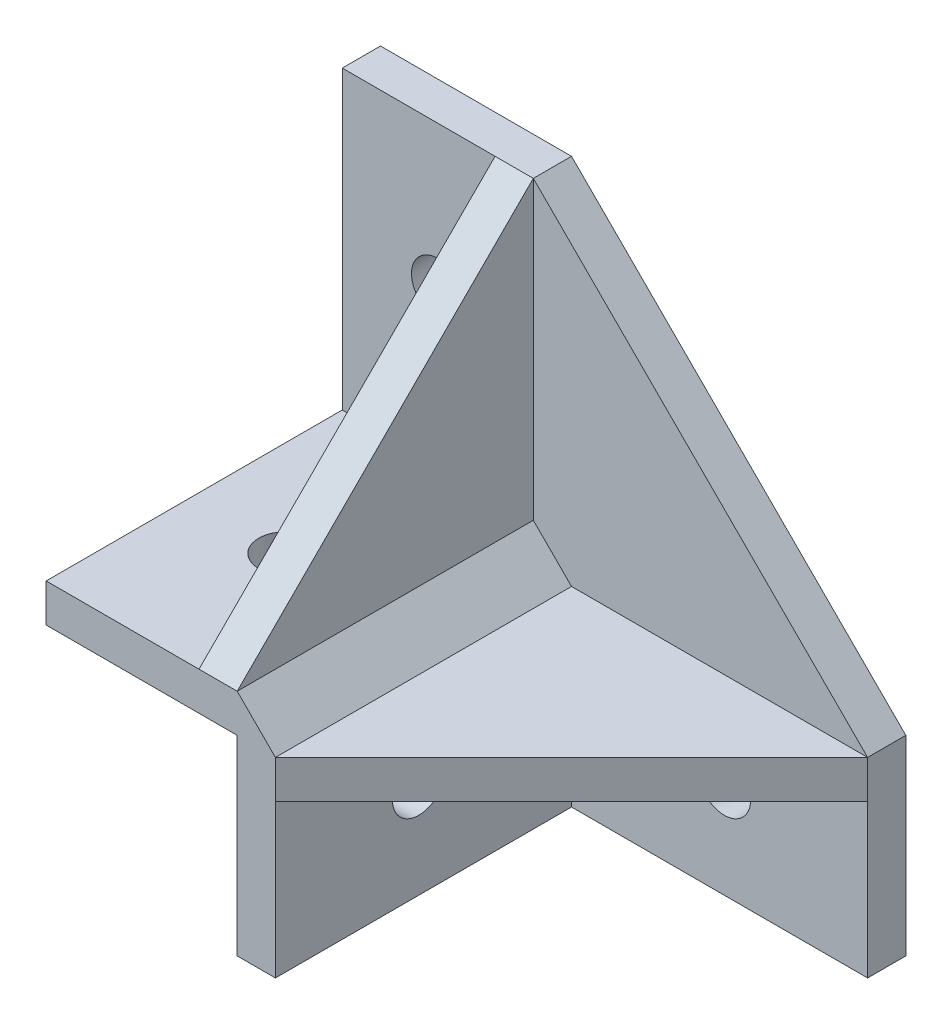
ISO-10303-21;
HEADER;
FILE_DESCRIPTION(('STEP AP214'),'2;1');
FILE_NAME('part.step','',(''),(''),'','','');
FILE_SCHEMA(('AUTOMOTIVE_DESIGN { 1 0 10303 214 1 1 1 1 }'));
ENDSEC;
DATA;
#1=APPLICATION_CONTEXT('core data for automotive mechanical design processes');
#2=APPLICATION_PROTOCOL_DEFINITION('international standard','automotive_design',2000,#1);
#3=PRODUCT_CONTEXT('',#1,'mechanical');
#4=PRODUCT('Part','Part','',(#3));
#5=PRODUCT_RELATED_PRODUCT_CATEGORY('part','',(#4));
#6=PRODUCT_DEFINITION_FORMATION('','',#4);
#7=PRODUCT_DEFINITION_CONTEXT('part definition',#1,'design');
#8=PRODUCT_DEFINITION('design','',#6,#7);
#9=PRODUCT_DEFINITION_SHAPE('','',#8);
#10=(LENGTH_UNIT() NAMED_UNIT(*) SI_UNIT(.MILLI.,.METRE.));
#11=(NAMED_UNIT(*) PLANE_ANGLE_UNIT() SI_UNIT($,.RADIAN.));
#12=(NAMED_UNIT(*) SI_UNIT($,.STERADIAN.) SOLID_ANGLE_UNIT());
#13=UNCERTAINTY_MEASURE_WITH_UNIT(LENGTH_MEASURE(1.E-05),#10,'distance_accuracy_value','');
#14=(GEOMETRIC_REPRESENTATION_CONTEXT(3) GLOBAL_UNCERTAINTY_ASSIGNED_CONTEXT((#13)) GLOBAL_UNIT_ASSIGNED_CONTEXT((#10,
#11,#12)) REPRESENTATION_CONTEXT('',''));
#15=CARTESIAN_POINT('',(0.,0.,0.));
#16=DIRECTION('',(0.,0.,1.));
#17=DIRECTION('',(1.,0.,0.));
#18=AXIS2_PLACEMENT_3D('',#15,#16,#17);
#19=CARTESIAN_POINT('',(0.,0.,4.));
#20=DIRECTION('',(0.,0.,1.));
#21=DIRECTION('',(1.,0.,0.));
#22=AXIS2_PLACEMENT_3D('',#19,#20,#21);
#23=PLANE('',#22);
#24=CARTESIAN_POINT('',(-10.,20.,4.));
#25=DIRECTION('',(0.,0.,1.));
#26=DIRECTION('',(1.,0.,0.));
#27=AXIS2_PLACEMENT_3D('',#24,#25,#26);
#28=CIRCLE('',#27,2.75);
#29=CARTESIAN_POINT('',(-7.25,20.,4.));
#30=VERTEX_POINT('',#29);
#31=EDGE_CURVE('E174',#30,#30,#28,.F.);
#32=ORIENTED_EDGE('',*,*,#31,.T.);
#33=EDGE_LOOP('',(#32));
#34=FACE_BOUND('',#33,.T.);
#35=DIRECTION('',(-1.,0.,0.));
#36=VECTOR('',#35,1.);
#37=CARTESIAN_POINT('',(-20.,4.,4.));
#38=LINE('',#37,#36);
#39=CARTESIAN_POINT('',(-4.,4.,4.));
#40=VERTEX_POINT('',#39);
#41=CARTESIAN_POINT('',(-20.,4.,4.));
#42=VERTEX_POINT('',#41);
#43=EDGE_CURVE('E54',#40,#42,#38,.T.);
#44=ORIENTED_EDGE('',*,*,#43,.F.);
#45=DIRECTION('',(0.,-1.,0.));
#46=VECTOR('',#45,1.);
#47=CARTESIAN_POINT('',(-4.,35.,4.));
#48=LINE('',#47,#46);
#49=CARTESIAN_POINT('',(-4.,35.,4.));
#50=VERTEX_POINT('',#49);
#51=EDGE_CURVE('E171',#50,#40,#48,.T.);
#52=ORIENTED_EDGE('',*,*,#51,.F.);
#53=DIRECTION('',(-1.,0.,0.));
#54=VECTOR('',#53,1.);
#55=CARTESIAN_POINT('',(-20.,35.,4.));
#56=LINE('',#55,#54);
#57=CARTESIAN_POINT('',(-20.,35.,4.));
#58=VERTEX_POINT('',#57);
#59=EDGE_CURVE('E227',#50,#58,#56,.T.);
#60=ORIENTED_EDGE('',*,*,#59,.T.);
#61=DIRECTION('',(0.,-1.,0.));
#62=VECTOR('',#61,1.);
#63=CARTESIAN_POINT('',(-20.,35.,4.));
#64=LINE('',#63,#62);
#65=EDGE_CURVE('E217',#58,#42,#64,.T.);
#66=ORIENTED_EDGE('',*,*,#65,.T.);
#67=EDGE_LOOP('',(#44,#52,#60,#66));
#68=FACE_BOUND('',#67,.T.);
#69=ADVANCED_FACE('F39',(#34,#68),#23,.T.);
#70=DIRECTION('',(0.,1.,0.));
#71=VECTOR('',#70,1.);
#72=CARTESIAN_POINT('',(0.,4.,4.));
#73=LINE('',#72,#71);
#74=CARTESIAN_POINT('',(0.,4.,4.));
#75=VERTEX_POINT('',#74);
#76=CARTESIAN_POINT('',(0.,35.,4.));
#77=VERTEX_POINT('',#76);
#78=EDGE_CURVE('E62',#75,#77,#73,.T.);
#79=ORIENTED_EDGE('',*,*,#78,.F.);
#80=DIRECTION('',(-0.707106781186548,0.707106781186548,0.));
#81=VECTOR('',#80,1.);
#82=CARTESIAN_POINT('',(4.,0.,4.));
#83=LINE('',#82,#81);
#84=CARTESIAN_POINT('',(4.,0.,4.));
#85=VERTEX_POINT('',#84);
#86=EDGE_CURVE('E197',#85,#75,#83,.T.);
#87=ORIENTED_EDGE('',*,*,#86,.F.);
#88=DIRECTION('',(-1.,0.,0.));
#89=VECTOR('',#88,1.);
#90=CARTESIAN_POINT('',(35.,0.,4.));
#91=LINE('',#90,#89);
#92=CARTESIAN_POINT('',(35.,0.,4.));
#93=VERTEX_POINT('',#92);
#94=EDGE_CURVE('E194',#93,#85,#91,.T.);
#95=ORIENTED_EDGE('',*,*,#94,.F.);
#96=DIRECTION('',(-0.707106781186548,0.707106781186548,0.));
#97=VECTOR('',#96,1.);
#98=CARTESIAN_POINT('',(0.,35.,4.));
#99=LINE('',#98,#97);
#100=EDGE_CURVE('E225',#93,#77,#99,.T.);
#101=ORIENTED_EDGE('',*,*,#100,.T.);
#102=EDGE_LOOP('',(#79,#87,#95,#101));
#103=FACE_BOUND('',#102,.T.);
#104=ADVANCED_FACE('F337',(#103),#23,.T.);
#105=CARTESIAN_POINT('',(-20.,35.,4.));
#106=DIRECTION('',(1.,0.,0.));
#107=DIRECTION('',(0.,1.,0.));
#108=AXIS2_PLACEMENT_3D('',#105,#106,#107);
#109=PLANE('',#108);
#110=DIRECTION('',(0.,-1.,0.));
#111=VECTOR('',#110,1.);
#112=CARTESIAN_POINT('',(-20.,35.,0.));
#113=LINE('',#112,#111);
#114=CARTESIAN_POINT('',(-20.,35.,0.));
#115=VERTEX_POINT('',#114);
#116=CARTESIAN_POINT('',(-20.,0.,0.));
#117=VERTEX_POINT('',#116);
#118=EDGE_CURVE('E150',#115,#117,#113,.T.);
#119=ORIENTED_EDGE('',*,*,#118,.T.);
#120=DIRECTION('',(0.,0.,-1.));
#121=VECTOR('',#120,1.);
#122=CARTESIAN_POINT('',(-20.,0.,4.));
#123=LINE('',#122,#121);
#124=CARTESIAN_POINT('',(-20.,0.,35.));
#125=VERTEX_POINT('',#124);
#126=EDGE_CURVE('E142',#125,#117,#123,.T.);
#127=ORIENTED_EDGE('',*,*,#126,.F.);
#128=DIRECTION('',(0.,-1.,0.));
#129=VECTOR('',#128,1.);
#130=CARTESIAN_POINT('',(-20.,0.,35.));
#131=LINE('',#130,#129);
#132=CARTESIAN_POINT('',(-20.,4.,35.));
#133=VERTEX_POINT('',#132);
#134=EDGE_CURVE('E147',#133,#125,#131,.T.);
#135=ORIENTED_EDGE('',*,*,#134,.F.);
#136=DIRECTION('',(0.,0.,-1.));
#137=VECTOR('',#136,1.);
#138=CARTESIAN_POINT('',(-20.,4.,35.));
#139=LINE('',#138,#137);
#140=EDGE_CURVE('E186',#133,#42,#139,.T.);
#141=ORIENTED_EDGE('',*,*,#140,.T.);
#142=ORIENTED_EDGE('',*,*,#65,.F.);
#143=DIRECTION('',(0.,0.,-1.));
#144=VECTOR('',#143,1.);
#145=CARTESIAN_POINT('',(-20.,35.,4.));
#146=LINE('',#145,#144);
#147=EDGE_CURVE('E229',#58,#115,#146,.T.);
#148=ORIENTED_EDGE('',*,*,#147,.T.);
#149=EDGE_LOOP('',(#119,#127,#135,#141,#142,#148));
#150=FACE_BOUND('',#149,.T.);
#151=ADVANCED_FACE('F144',(#150),#109,.F.);
#152=CARTESIAN_POINT('',(-20.,0.,4.));
#153=DIRECTION('',(0.,1.,0.));
#154=DIRECTION('',(0.,0.,1.));
#155=AXIS2_PLACEMENT_3D('',#152,#153,#154);
#156=PLANE('',#155);
#157=CARTESIAN_POINT('',(-10.,0.,20.));
#158=DIRECTION('',(0.,-1.,0.));
#159=DIRECTION('',(0.,0.,-1.));
#160=AXIS2_PLACEMENT_3D('',#157,#158,#159);
#161=CIRCLE('',#160,2.75);
#162=CARTESIAN_POINT('',(-10.,0.,17.25));
#163=VERTEX_POINT('',#162);
#164=EDGE_CURVE('E360',#163,#163,#161,.T.);
#165=ORIENTED_EDGE('',*,*,#164,.F.);
#166=EDGE_LOOP('',(#165));
#167=FACE_BOUND('',#166,.T.);
#168=DIRECTION('',(1.,0.,0.));
#169=VECTOR('',#168,1.);
#170=CARTESIAN_POINT('',(-20.,0.,0.));
#171=LINE('',#170,#169);
#172=CARTESIAN_POINT('',(0.,0.,0.));
#173=VERTEX_POINT('',#172);
#174=EDGE_CURVE('E231',#117,#173,#171,.T.);
#175=ORIENTED_EDGE('',*,*,#174,.T.);
#176=DIRECTION('',(0.,0.,-1.));
#177=VECTOR('',#176,1.);
#178=CARTESIAN_POINT('',(0.,0.,4.));
#179=LINE('',#178,#177);
#180=CARTESIAN_POINT('',(0.,0.,35.));
#181=VERTEX_POINT('',#180);
#182=EDGE_CURVE('E153',#181,#173,#179,.T.);
#183=ORIENTED_EDGE('',*,*,#182,.F.);
#184=DIRECTION('',(1.,0.,0.));
#185=VECTOR('',#184,1.);
#186=CARTESIAN_POINT('',(-20.,0.,35.));
#187=LINE('',#186,#185);
#188=EDGE_CURVE('E156',#125,#181,#187,.T.);
#189=ORIENTED_EDGE('',*,*,#188,.F.);
#190=ORIENTED_EDGE('',*,*,#126,.T.);
#191=EDGE_LOOP('',(#175,#183,#189,#190));
#192=FACE_BOUND('',#191,.T.);
#193=ADVANCED_FACE('F157',(#167,#192),#156,.F.);
#194=CARTESIAN_POINT('',(0.,0.,4.));
#195=DIRECTION('',(1.,0.,0.));
#196=DIRECTION('',(0.,0.,-1.));
#197=AXIS2_PLACEMENT_3D('',#194,#195,#196);
#198=PLANE('',#197);
#199=CARTESIAN_POINT('',(0.,-10.,20.));
#200=DIRECTION('',(-1.,0.,0.));
#201=DIRECTION('',(0.,0.,1.));
#202=AXIS2_PLACEMENT_3D('',#199,#200,#201);
#203=CIRCLE('',#202,2.75);
#204=CARTESIAN_POINT('',(0.,-10.,22.75));
#205=VERTEX_POINT('',#204);
#206=EDGE_CURVE('E549',#205,#205,#203,.T.);
#207=ORIENTED_EDGE('',*,*,#206,.F.);
#208=EDGE_LOOP('',(#207));
#209=FACE_BOUND('',#208,.T.);
#210=DIRECTION('',(0.,-1.,0.));
#211=VECTOR('',#210,1.);
#212=CARTESIAN_POINT('',(0.,0.,0.));
#213=LINE('',#212,#211);
#214=CARTESIAN_POINT('',(0.,-20.,0.));
#215=VERTEX_POINT('',#214);
#216=EDGE_CURVE('E233',#173,#215,#213,.T.);
#217=ORIENTED_EDGE('',*,*,#216,.T.);
#218=DIRECTION('',(0.,0.,-1.));
#219=VECTOR('',#218,1.);
#220=CARTESIAN_POINT('',(0.,-20.,4.));
#221=LINE('',#220,#219);
#222=CARTESIAN_POINT('',(0.,-20.,35.));
#223=VERTEX_POINT('',#222);
#224=EDGE_CURVE('E252',#223,#215,#221,.T.);
#225=ORIENTED_EDGE('',*,*,#224,.F.);
#226=DIRECTION('',(0.,-1.,0.));
#227=VECTOR('',#226,1.);
#228=CARTESIAN_POINT('',(0.,0.,35.));
#229=LINE('',#228,#227);
#230=EDGE_CURVE('E162',#181,#223,#229,.T.);
#231=ORIENTED_EDGE('',*,*,#230,.F.);
#232=ORIENTED_EDGE('',*,*,#182,.T.);
#233=EDGE_LOOP('',(#217,#225,#231,#232));
#234=FACE_BOUND('',#233,.T.);
#235=ADVANCED_FACE('F317',(#209,#234),#198,.F.);
#236=CARTESIAN_POINT('',(0.,-20.,4.));
#237=DIRECTION('',(0.,1.,0.));
#238=DIRECTION('',(-1.,0.,0.));
#239=AXIS2_PLACEMENT_3D('',#236,#237,#238);
#240=PLANE('',#239);
#241=DIRECTION('',(1.,0.,0.));
#242=VECTOR('',#241,1.);
#243=CARTESIAN_POINT('',(0.,-20.,0.));
#244=LINE('',#243,#242);
#245=CARTESIAN_POINT('',(35.,-20.,0.));
#246=VERTEX_POINT('',#245);
#247=EDGE_CURVE('E235',#215,#246,#244,.T.);
#248=ORIENTED_EDGE('',*,*,#247,.T.);
#249=DIRECTION('',(0.,0.,-1.));
#250=VECTOR('',#249,1.);
#251=CARTESIAN_POINT('',(35.,-20.,4.));
#252=LINE('',#251,#250);
#253=CARTESIAN_POINT('',(35.,-20.,4.));
#254=VERTEX_POINT('',#253);
#255=EDGE_CURVE('E249',#254,#246,#252,.T.);
#256=ORIENTED_EDGE('',*,*,#255,.F.);
#257=DIRECTION('',(1.,0.,0.));
#258=VECTOR('',#257,1.);
#259=CARTESIAN_POINT('',(0.,-20.,4.));
#260=LINE('',#259,#258);
#261=CARTESIAN_POINT('',(4.,-20.,4.));
#262=VERTEX_POINT('',#261);
#263=EDGE_CURVE('E219',#262,#254,#260,.T.);
#264=ORIENTED_EDGE('',*,*,#263,.F.);
#265=DIRECTION('',(0.,0.,-1.));
#266=VECTOR('',#265,1.);
#267=CARTESIAN_POINT('',(4.,-20.,35.));
#268=LINE('',#267,#266);
#269=CARTESIAN_POINT('',(4.,-20.,35.));
#270=VERTEX_POINT('',#269);
#271=EDGE_CURVE('E214',#270,#262,#268,.T.);
#272=ORIENTED_EDGE('',*,*,#271,.F.);
#273=DIRECTION('',(1.,0.,0.));
#274=VECTOR('',#273,1.);
#275=CARTESIAN_POINT('',(0.,-20.,35.));
#276=LINE('',#275,#274);
#277=EDGE_CURVE('E178',#223,#270,#276,.T.);
#278=ORIENTED_EDGE('',*,*,#277,.F.);
#279=ORIENTED_EDGE('',*,*,#224,.T.);
#280=EDGE_LOOP('',(#248,#256,#264,#272,#278,#279));
#281=FACE_BOUND('',#280,.T.);
#282=ADVANCED_FACE('F321',(#281),#240,.F.);
#283=CARTESIAN_POINT('',(35.,0.,4.));
#284=DIRECTION('',(-1.,0.,0.));
#285=DIRECTION('',(0.,0.,1.));
#286=AXIS2_PLACEMENT_3D('',#283,#284,#285);
#287=PLANE('',#286);
#288=DIRECTION('',(0.,0.,-1.));
#289=VECTOR('',#288,1.);
#290=CARTESIAN_POINT('',(35.,0.,4.));
#291=LINE('',#290,#289);
#292=CARTESIAN_POINT('',(35.,0.,0.));
#293=VERTEX_POINT('',#292);
#294=EDGE_CURVE('E246',#93,#293,#291,.T.);
#295=ORIENTED_EDGE('',*,*,#294,.F.);
#296=DIRECTION('',(0.,-1.,0.));
#297=VECTOR('',#296,1.);
#298=CARTESIAN_POINT('',(35.,0.,3.99999999999987));
#299=LINE('',#298,#297);
#300=CARTESIAN_POINT('',(35.,-4.,4.));
#301=VERTEX_POINT('',#300);
#302=EDGE_CURVE('E47',#93,#301,#299,.T.);
#303=ORIENTED_EDGE('',*,*,#302,.T.);
#304=DIRECTION('',(0.,1.,0.));
#305=VECTOR('',#304,1.);
#306=CARTESIAN_POINT('',(35.,0.,4.));
#307=LINE('',#306,#305);
#308=EDGE_CURVE('E222',#254,#301,#307,.T.);
#309=ORIENTED_EDGE('',*,*,#308,.F.);
#310=ORIENTED_EDGE('',*,*,#255,.T.);
#311=DIRECTION('',(0.,1.,0.));
#312=VECTOR('',#311,1.);
#313=CARTESIAN_POINT('',(35.,0.,0.));
#314=LINE('',#313,#312);
#315=EDGE_CURVE('E237',#246,#293,#314,.T.);
#316=ORIENTED_EDGE('',*,*,#315,.T.);
#317=EDGE_LOOP('',(#295,#303,#309,#310,#316));
#318=FACE_BOUND('',#317,.T.);
#319=ADVANCED_FACE('F271',(#318),#287,.F.);
#320=CARTESIAN_POINT('',(0.,35.,4.));
#321=DIRECTION('',(-0.707106781186547,-0.707106781186547,0.));
#322=DIRECTION('',(0.707106781186548,-0.707106781186548,0.));
#323=AXIS2_PLACEMENT_3D('',#320,#321,#322);
#324=PLANE('',#323);
#325=DIRECTION('',(-0.707106781186548,0.707106781186548,0.));
#326=VECTOR('',#325,1.);
#327=CARTESIAN_POINT('',(0.,35.,0.));
#328=LINE('',#327,#326);
#329=CARTESIAN_POINT('',(0.,35.,0.));
#330=VERTEX_POINT('',#329);
#331=EDGE_CURVE('E239',#293,#330,#328,.T.);
#332=ORIENTED_EDGE('',*,*,#331,.T.);
#333=DIRECTION('',(0.,0.,-1.));
#334=VECTOR('',#333,1.);
#335=CARTESIAN_POINT('',(0.,35.,4.));
#336=LINE('',#335,#334);
#337=EDGE_CURVE('E243',#77,#330,#336,.T.);
#338=ORIENTED_EDGE('',*,*,#337,.F.);
#339=ORIENTED_EDGE('',*,*,#100,.F.);
#340=ORIENTED_EDGE('',*,*,#294,.T.);
#341=EDGE_LOOP('',(#332,#338,#339,#340));
#342=FACE_BOUND('',#341,.T.);
#343=ADVANCED_FACE('F348',(#342),#324,.F.);
#344=CARTESIAN_POINT('',(-20.,35.,4.));
#345=DIRECTION('',(0.,-1.,0.));
#346=DIRECTION('',(0.,0.,-1.));
#347=AXIS2_PLACEMENT_3D('',#344,#345,#346);
#348=PLANE('',#347);
#349=ORIENTED_EDGE('',*,*,#59,.F.);
#350=DIRECTION('',(1.,0.,0.));
#351=VECTOR('',#350,1.);
#352=CARTESIAN_POINT('',(-20.,35.,3.99999999999987));
#353=LINE('',#352,#351);
#354=EDGE_CURVE('E262',#50,#77,#353,.T.);
#355=ORIENTED_EDGE('',*,*,#354,.T.);
#356=ORIENTED_EDGE('',*,*,#337,.T.);
#357=DIRECTION('',(-1.,0.,0.));
#358=VECTOR('',#357,1.);
#359=CARTESIAN_POINT('',(-20.,35.,0.));
#360=LINE('',#359,#358);
#361=EDGE_CURVE('E220',#330,#115,#360,.T.);
#362=ORIENTED_EDGE('',*,*,#361,.T.);
#363=ORIENTED_EDGE('',*,*,#147,.F.);
#364=EDGE_LOOP('',(#349,#355,#356,#362,#363));
#365=FACE_BOUND('',#364,.T.);
#366=ADVANCED_FACE('F307',(#365),#348,.F.);
#367=CARTESIAN_POINT('',(20.,-10.,4.));
#368=DIRECTION('',(0.,0.,1.));
#369=DIRECTION('',(1.,0.,0.));
#370=AXIS2_PLACEMENT_3D('',#367,#368,#369);
#371=CIRCLE('',#370,2.75);
#372=CARTESIAN_POINT('',(22.75,-10.,4.));
#373=VERTEX_POINT('',#372);
#374=EDGE_CURVE('E352',#373,#373,#371,.F.);
#375=ORIENTED_EDGE('',*,*,#374,.T.);
#376=EDGE_LOOP('',(#375));
#377=FACE_BOUND('',#376,.T.);
#378=DIRECTION('',(1.,0.,0.));
#379=VECTOR('',#378,1.);
#380=CARTESIAN_POINT('',(4.,-4.,4.));
#381=LINE('',#380,#379);
#382=CARTESIAN_POINT('',(4.,-4.,4.));
#383=VERTEX_POINT('',#382);
#384=EDGE_CURVE('E190',#383,#301,#381,.T.);
#385=ORIENTED_EDGE('',*,*,#384,.F.);
#386=DIRECTION('',(0.,1.,0.));
#387=VECTOR('',#386,1.);
#388=CARTESIAN_POINT('',(4.,-20.,4.));
#389=LINE('',#388,#387);
#390=EDGE_CURVE('E187',#262,#383,#389,.T.);
#391=ORIENTED_EDGE('',*,*,#390,.F.);
#392=ORIENTED_EDGE('',*,*,#263,.T.);
#393=ORIENTED_EDGE('',*,*,#308,.T.);
#394=EDGE_LOOP('',(#385,#391,#392,#393));
#395=FACE_BOUND('',#394,.T.);
#396=ADVANCED_FACE('F276',(#377,#395),#23,.T.);
#397=CARTESIAN_POINT('',(0.,0.,0.));
#398=DIRECTION('',(0.,0.,1.));
#399=DIRECTION('',(1.,0.,0.));
#400=AXIS2_PLACEMENT_3D('',#397,#398,#399);
#401=PLANE('',#400);
#402=CARTESIAN_POINT('',(20.,-10.,0.));
#403=DIRECTION('',(0.,0.,-1.));
#404=DIRECTION('',(-1.,0.,0.));
#405=AXIS2_PLACEMENT_3D('',#402,#403,#404);
#406=CIRCLE('',#405,2.75);
#407=CARTESIAN_POINT('',(17.25,-10.,0.));
#408=VERTEX_POINT('',#407);
#409=EDGE_CURVE('E354',#408,#408,#406,.T.);
#410=ORIENTED_EDGE('',*,*,#409,.F.);
#411=EDGE_LOOP('',(#410));
#412=FACE_BOUND('',#411,.T.);
#413=CARTESIAN_POINT('',(-10.,20.,0.));
#414=DIRECTION('',(0.,0.,-1.));
#415=DIRECTION('',(-1.,0.,0.));
#416=AXIS2_PLACEMENT_3D('',#413,#414,#415);
#417=CIRCLE('',#416,2.75);
#418=CARTESIAN_POINT('',(-12.75,20.,0.));
#419=VERTEX_POINT('',#418);
#420=EDGE_CURVE('E191',#419,#419,#417,.T.);
#421=ORIENTED_EDGE('',*,*,#420,.F.);
#422=EDGE_LOOP('',(#421));
#423=FACE_BOUND('',#422,.T.);
#424=ORIENTED_EDGE('',*,*,#118,.F.);
#425=ORIENTED_EDGE('',*,*,#361,.F.);
#426=ORIENTED_EDGE('',*,*,#331,.F.);
#427=ORIENTED_EDGE('',*,*,#315,.F.);
#428=ORIENTED_EDGE('',*,*,#247,.F.);
#429=ORIENTED_EDGE('',*,*,#216,.F.);
#430=ORIENTED_EDGE('',*,*,#174,.F.);
#431=EDGE_LOOP('',(#424,#425,#426,#427,#428,#429,#430));
#432=FACE_BOUND('',#431,.T.);
#433=ADVANCED_FACE('F312',(#412,#423,#432),#401,.F.);
#434=CARTESIAN_POINT('',(4.,-20.,35.));
#435=DIRECTION('',(-1.,0.,0.));
#436=DIRECTION('',(0.,0.,1.));
#437=AXIS2_PLACEMENT_3D('',#434,#435,#436);
#438=PLANE('',#437);
#439=CARTESIAN_POINT('',(4.,-10.,20.));
#440=DIRECTION('',(-1.,0.,0.));
#441=DIRECTION('',(0.,0.,1.));
#442=AXIS2_PLACEMENT_3D('',#439,#440,#441);
#443=CIRCLE('',#442,2.75);
#444=CARTESIAN_POINT('',(4.,-10.,22.75));
#445=VERTEX_POINT('',#444);
#446=EDGE_CURVE('E546',#445,#445,#443,.F.);
#447=ORIENTED_EDGE('',*,*,#446,.F.);
#448=EDGE_LOOP('',(#447));
#449=FACE_BOUND('',#448,.T.);
#450=ORIENTED_EDGE('',*,*,#390,.T.);
#451=DIRECTION('',(0.,0.,-1.));
#452=VECTOR('',#451,1.);
#453=CARTESIAN_POINT('',(4.,-4.,35.));
#454=LINE('',#453,#452);
#455=CARTESIAN_POINT('',(4.,-4.,35.));
#456=VERTEX_POINT('',#455);
#457=EDGE_CURVE('E211',#456,#383,#454,.T.);
#458=ORIENTED_EDGE('',*,*,#457,.F.);
#459=DIRECTION('',(0.,1.,0.));
#460=VECTOR('',#459,1.);
#461=CARTESIAN_POINT('',(4.,-20.,35.));
#462=LINE('',#461,#460);
#463=EDGE_CURVE('E180',#270,#456,#462,.T.);
#464=ORIENTED_EDGE('',*,*,#463,.F.);
#465=ORIENTED_EDGE('',*,*,#271,.T.);
#466=EDGE_LOOP('',(#450,#458,#464,#465));
#467=FACE_BOUND('',#466,.T.);
#468=ADVANCED_FACE('F323',(#449,#467),#438,.F.);
#469=CARTESIAN_POINT('',(4.,-4.,35.));
#470=DIRECTION('',(0.,1.,0.));
#471=DIRECTION('',(0.,0.,1.));
#472=AXIS2_PLACEMENT_3D('',#469,#470,#471);
#473=PLANE('',#472);
#474=ORIENTED_EDGE('',*,*,#384,.T.);
#475=DIRECTION('',(0.707106781186546,0.,-0.707106781186549));
#476=VECTOR('',#475,1.);
#477=CARTESIAN_POINT('',(4.,-4.,35.));
#478=LINE('',#477,#476);
#479=EDGE_CURVE('E11',#301,#456,#478,.F.);
#480=ORIENTED_EDGE('',*,*,#479,.T.);
#481=ORIENTED_EDGE('',*,*,#457,.T.);
#482=EDGE_LOOP('',(#474,#480,#481));
#483=FACE_BOUND('',#482,.T.);
#484=ADVANCED_FACE('F280',(#483),#473,.F.);
#485=CARTESIAN_POINT('',(35.,0.,35.));
#486=DIRECTION('',(0.,-1.,0.));
#487=DIRECTION('',(0.,0.,-1.));
#488=AXIS2_PLACEMENT_3D('',#485,#486,#487);
#489=PLANE('',#488);
#490=DIRECTION('',(0.,0.,-1.));
#491=VECTOR('',#490,1.);
#492=CARTESIAN_POINT('',(4.,0.,35.));
#493=LINE('',#492,#491);
#494=CARTESIAN_POINT('',(4.,0.,35.));
#495=VERTEX_POINT('',#494);
#496=EDGE_CURVE('E208',#495,#85,#493,.T.);
#497=ORIENTED_EDGE('',*,*,#496,.F.);
#498=DIRECTION('',(-0.707106781186546,0.,0.707106781186549));
#499=VECTOR('',#498,1.);
#500=CARTESIAN_POINT('',(4.,0.,35.));
#501=LINE('',#500,#499);
#502=EDGE_CURVE('E266',#495,#93,#501,.F.);
#503=ORIENTED_EDGE('',*,*,#502,.T.);
#504=ORIENTED_EDGE('',*,*,#94,.T.);
#505=EDGE_LOOP('',(#497,#503,#504));
#506=FACE_BOUND('',#505,.T.);
#507=ADVANCED_FACE('F288',(#506),#489,.F.);
#508=CARTESIAN_POINT('',(4.,0.,35.));
#509=DIRECTION('',(-0.707106781186548,-0.707106781186548,0.));
#510=DIRECTION('',(0.707106781186548,-0.707106781186548,0.));
#511=AXIS2_PLACEMENT_3D('',#508,#509,#510);
#512=PLANE('',#511);
#513=ORIENTED_EDGE('',*,*,#86,.T.);
#514=DIRECTION('',(0.,0.,-1.));
#515=VECTOR('',#514,1.);
#516=CARTESIAN_POINT('',(0.,4.,35.));
#517=LINE('',#516,#515);
#518=CARTESIAN_POINT('',(0.,4.,35.));
#519=VERTEX_POINT('',#518);
#520=EDGE_CURVE('E205',#519,#75,#517,.T.);
#521=ORIENTED_EDGE('',*,*,#520,.F.);
#522=DIRECTION('',(-0.707106781186548,0.707106781186548,0.));
#523=VECTOR('',#522,1.);
#524=CARTESIAN_POINT('',(4.,0.,35.));
#525=LINE('',#524,#523);
#526=EDGE_CURVE('E183',#495,#519,#525,.T.);
#527=ORIENTED_EDGE('',*,*,#526,.F.);
#528=ORIENTED_EDGE('',*,*,#496,.T.);
#529=EDGE_LOOP('',(#513,#521,#527,#528));
#530=FACE_BOUND('',#529,.T.);
#531=ADVANCED_FACE('F291',(#530),#512,.F.);
#532=CARTESIAN_POINT('',(0.,4.,35.));
#533=DIRECTION('',(-1.,0.,0.));
#534=DIRECTION('',(0.,0.,1.));
#535=AXIS2_PLACEMENT_3D('',#532,#533,#534);
#536=PLANE('',#535);
#537=ORIENTED_EDGE('',*,*,#78,.T.);
#538=DIRECTION('',(0.,0.707106781186546,-0.707106781186549));
#539=VECTOR('',#538,1.);
#540=CARTESIAN_POINT('',(0.,4.,35.));
#541=LINE('',#540,#539);
#542=EDGE_CURVE('E264',#77,#519,#541,.F.);
#543=ORIENTED_EDGE('',*,*,#542,.T.);
#544=ORIENTED_EDGE('',*,*,#520,.T.);
#545=EDGE_LOOP('',(#537,#543,#544));
#546=FACE_BOUND('',#545,.T.);
#547=ADVANCED_FACE('F386',(#546),#536,.F.);
#548=CARTESIAN_POINT('',(-4.,35.,35.));
#549=DIRECTION('',(1.,0.,0.));
#550=DIRECTION('',(0.,1.,0.));
#551=AXIS2_PLACEMENT_3D('',#548,#549,#550);
#552=PLANE('',#551);
#553=DIRECTION('',(0.,0.,-1.));
#554=VECTOR('',#553,1.);
#555=CARTESIAN_POINT('',(-4.,4.,35.));
#556=LINE('',#555,#554);
#557=CARTESIAN_POINT('',(-4.,4.,35.));
#558=VERTEX_POINT('',#557);
#559=EDGE_CURVE('E202',#558,#40,#556,.T.);
#560=ORIENTED_EDGE('',*,*,#559,.F.);
#561=DIRECTION('',(0.,-0.707106781186546,0.707106781186549));
#562=VECTOR('',#561,1.);
#563=CARTESIAN_POINT('',(-4.,4.,35.));
#564=LINE('',#563,#562);
#565=EDGE_CURVE('E260',#558,#50,#564,.F.);
#566=ORIENTED_EDGE('',*,*,#565,.T.);
#567=ORIENTED_EDGE('',*,*,#51,.T.);
#568=EDGE_LOOP('',(#560,#566,#567));
#569=FACE_BOUND('',#568,.T.);
#570=ADVANCED_FACE('F300',(#569),#552,.F.);
#571=CARTESIAN_POINT('',(-20.,4.,35.));
#572=DIRECTION('',(0.,-1.,0.));
#573=DIRECTION('',(0.,0.,-1.));
#574=AXIS2_PLACEMENT_3D('',#571,#572,#573);
#575=PLANE('',#574);
#576=CARTESIAN_POINT('',(-10.,4.,20.));
#577=DIRECTION('',(0.,-1.,0.));
#578=DIRECTION('',(0.,0.,-1.));
#579=AXIS2_PLACEMENT_3D('',#576,#577,#578);
#580=CIRCLE('',#579,2.75);
#581=CARTESIAN_POINT('',(-10.,4.,17.25));
#582=VERTEX_POINT('',#581);
#583=EDGE_CURVE('E355',#582,#582,#580,.F.);
#584=ORIENTED_EDGE('',*,*,#583,.F.);
#585=EDGE_LOOP('',(#584));
#586=FACE_BOUND('',#585,.T.);
#587=ORIENTED_EDGE('',*,*,#43,.T.);
#588=ORIENTED_EDGE('',*,*,#140,.F.);
#589=DIRECTION('',(-1.,0.,0.));
#590=VECTOR('',#589,1.);
#591=CARTESIAN_POINT('',(-20.,4.,35.));
#592=LINE('',#591,#590);
#593=EDGE_CURVE('E168',#558,#133,#592,.T.);
#594=ORIENTED_EDGE('',*,*,#593,.F.);
#595=ORIENTED_EDGE('',*,*,#559,.T.);
#596=EDGE_LOOP('',(#587,#588,#594,#595));
#597=FACE_BOUND('',#596,.T.);
#598=ADVANCED_FACE('F302',(#586,#597),#575,.F.);
#599=CARTESIAN_POINT('',(0.,0.,35.));
#600=DIRECTION('',(0.,0.,-1.));
#601=DIRECTION('',(-1.,0.,0.));
#602=AXIS2_PLACEMENT_3D('',#599,#600,#601);
#603=PLANE('',#602);
#604=ORIENTED_EDGE('',*,*,#526,.T.);
#605=DIRECTION('',(-1.,0.,0.));
#606=VECTOR('',#605,1.);
#607=CARTESIAN_POINT('',(0.,4.,35.));
#608=LINE('',#607,#606);
#609=EDGE_CURVE('E258',#519,#558,#608,.T.);
#610=ORIENTED_EDGE('',*,*,#609,.T.);
#611=ORIENTED_EDGE('',*,*,#593,.T.);
#612=ORIENTED_EDGE('',*,*,#134,.T.);
#613=ORIENTED_EDGE('',*,*,#188,.T.);
#614=ORIENTED_EDGE('',*,*,#230,.T.);
#615=ORIENTED_EDGE('',*,*,#277,.T.);
#616=ORIENTED_EDGE('',*,*,#463,.T.);
#617=DIRECTION('',(0.,1.,0.));
#618=VECTOR('',#617,1.);
#619=CARTESIAN_POINT('',(4.,0.,35.));
#620=LINE('',#619,#618);
#621=EDGE_CURVE('E152',#456,#495,#620,.T.);
#622=ORIENTED_EDGE('',*,*,#621,.T.);
#623=EDGE_LOOP('',(#604,#610,#611,#612,#613,#614,#615,#616,#622));
#624=FACE_BOUND('',#623,.T.);
#625=ADVANCED_FACE('F165',(#624),#603,.F.);
#626=CARTESIAN_POINT('',(0.,4.,35.));
#627=DIRECTION('',(0.,-0.707106781186549,-0.707106781186546));
#628=DIRECTION('',(-1.,0.,0.));
#629=AXIS2_PLACEMENT_3D('',#626,#627,#628);
#630=PLANE('',#629);
#631=ORIENTED_EDGE('',*,*,#542,.F.);
#632=ORIENTED_EDGE('',*,*,#354,.F.);
#633=ORIENTED_EDGE('',*,*,#565,.F.);
#634=ORIENTED_EDGE('',*,*,#609,.F.);
#635=EDGE_LOOP('',(#631,#632,#633,#634));
#636=FACE_BOUND('',#635,.T.);
#637=ADVANCED_FACE('F296',(#636),#630,.F.);
#638=CARTESIAN_POINT('',(4.,0.,35.));
#639=DIRECTION('',(-0.707106781186549,0.,-0.707106781186546));
#640=DIRECTION('',(0.,1.,0.));
#641=AXIS2_PLACEMENT_3D('',#638,#639,#640);
#642=PLANE('',#641);
#643=ORIENTED_EDGE('',*,*,#479,.F.);
#644=ORIENTED_EDGE('',*,*,#302,.F.);
#645=ORIENTED_EDGE('',*,*,#502,.F.);
#646=ORIENTED_EDGE('',*,*,#621,.F.);
#647=EDGE_LOOP('',(#643,#644,#645,#646));
#648=FACE_BOUND('',#647,.T.);
#649=ADVANCED_FACE('F41',(#648),#642,.F.);
#650=CARTESIAN_POINT('',(-10.,20.,35.001));
#651=DIRECTION('',(0.,0.,-1.));
#652=DIRECTION('',(-1.,0.,0.));
#653=AXIS2_PLACEMENT_3D('',#650,#651,#652);
#654=CYLINDRICAL_SURFACE('',#653,2.75);
#655=ORIENTED_EDGE('',*,*,#31,.F.);
#656=EDGE_LOOP('',(#655));
#657=FACE_BOUND('',#656,.T.);
#658=ORIENTED_EDGE('',*,*,#420,.T.);
#659=EDGE_LOOP('',(#658));
#660=FACE_BOUND('',#659,.T.);
#661=ADVANCED_FACE('F367',(#657,#660),#654,.F.);
#662=CARTESIAN_POINT('',(20.,-10.,35.001));
#663=DIRECTION('',(0.,0.,-1.));
#664=DIRECTION('',(-1.,0.,0.));
#665=AXIS2_PLACEMENT_3D('',#662,#663,#664);
#666=CYLINDRICAL_SURFACE('',#665,2.75);
#667=ORIENTED_EDGE('',*,*,#374,.F.);
#668=EDGE_LOOP('',(#667));
#669=FACE_BOUND('',#668,.T.);
#670=ORIENTED_EDGE('',*,*,#409,.T.);
#671=EDGE_LOOP('',(#670));
#672=FACE_BOUND('',#671,.T.);
#673=ADVANCED_FACE('F369',(#669,#672),#666,.F.);
#674=CARTESIAN_POINT('',(-10.,35.001,20.));
#675=DIRECTION('',(0.,-1.,0.));
#676=DIRECTION('',(0.,0.,-1.));
#677=AXIS2_PLACEMENT_3D('',#674,#675,#676);
#678=CYLINDRICAL_SURFACE('',#677,2.75);
#679=ORIENTED_EDGE('',*,*,#164,.T.);
#680=EDGE_LOOP('',(#679));
#681=FACE_BOUND('',#680,.T.);
#682=ORIENTED_EDGE('',*,*,#583,.T.);
#683=EDGE_LOOP('',(#682));
#684=FACE_BOUND('',#683,.T.);
#685=ADVANCED_FACE('F375',(#681,#684),#678,.F.);
#686=CARTESIAN_POINT('',(35.001,-10.,20.));
#687=DIRECTION('',(-1.,0.,0.));
#688=DIRECTION('',(0.,0.,1.));
#689=AXIS2_PLACEMENT_3D('',#686,#687,#688);
#690=CYLINDRICAL_SURFACE('',#689,2.75);
#691=ORIENTED_EDGE('',*,*,#206,.T.);
#692=EDGE_LOOP('',(#691));
#693=FACE_BOUND('',#692,.T.);
#694=ORIENTED_EDGE('',*,*,#446,.T.);
#695=EDGE_LOOP('',(#694));
#696=FACE_BOUND('',#695,.T.);
#697=ADVANCED_FACE('F528',(#693,#696),#690,.F.);
#698=CLOSED_SHELL('',(#69,#104,#151,#193,#235,#282,#319,#343,#366,#396,#433,#468,#484,#507,#531,
#547,#570,#598,#625,#637,#649,#661,#673,#685,#697));
#699=MANIFOLD_SOLID_BREP('B2',#698);
#700=ADVANCED_BREP_SHAPE_REPRESENTATION('',(#18,#699),#14);
#701=SHAPE_DEFINITION_REPRESENTATION(#9,#700);
ENDSEC;
END-ISO-10303-21;
